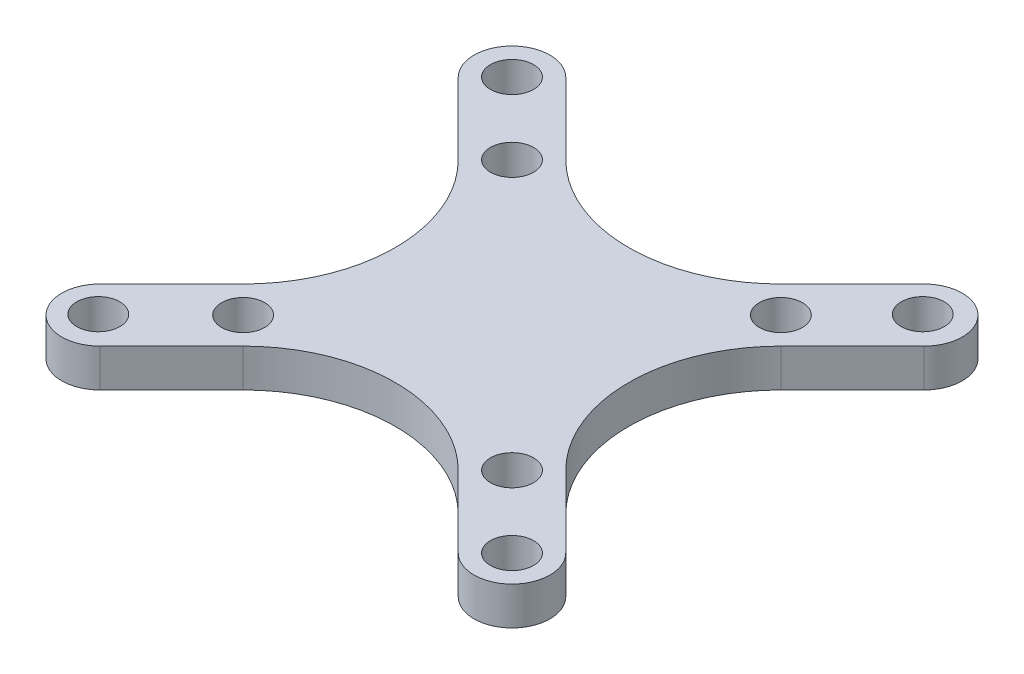
ISO-10303-21;
HEADER;
FILE_DESCRIPTION(('STEP AP214'),'2;1');
FILE_NAME('part.step','',(''),(''),'','','');
FILE_SCHEMA(('AUTOMOTIVE_DESIGN { 1 0 10303 214 1 1 1 1 }'));
ENDSEC;
DATA;
#1=APPLICATION_CONTEXT('core data for automotive mechanical design processes');
#2=APPLICATION_PROTOCOL_DEFINITION('international standard','automotive_design',2000,#1);
#3=PRODUCT_CONTEXT('',#1,'mechanical');
#4=PRODUCT('Part','Part','',(#3));
#5=PRODUCT_RELATED_PRODUCT_CATEGORY('part','',(#4));
#6=PRODUCT_DEFINITION_FORMATION('','',#4);
#7=PRODUCT_DEFINITION_CONTEXT('part definition',#1,'design');
#8=PRODUCT_DEFINITION('design','',#6,#7);
#9=PRODUCT_DEFINITION_SHAPE('','',#8);
#10=(LENGTH_UNIT() NAMED_UNIT(*) SI_UNIT(.MILLI.,.METRE.));
#11=(NAMED_UNIT(*) PLANE_ANGLE_UNIT() SI_UNIT($,.RADIAN.));
#12=(NAMED_UNIT(*) SI_UNIT($,.STERADIAN.) SOLID_ANGLE_UNIT());
#13=UNCERTAINTY_MEASURE_WITH_UNIT(LENGTH_MEASURE(1.E-05),#10,'distance_accuracy_value','');
#14=(GEOMETRIC_REPRESENTATION_CONTEXT(3) GLOBAL_UNCERTAINTY_ASSIGNED_CONTEXT((#13)) GLOBAL_UNIT_ASSIGNED_CONTEXT((#10,
#11,#12)) REPRESENTATION_CONTEXT('',''));
#15=CARTESIAN_POINT('',(0.,0.,0.));
#16=DIRECTION('',(0.,0.,1.));
#17=DIRECTION('',(1.,0.,0.));
#18=AXIS2_PLACEMENT_3D('',#15,#16,#17);
#19=CARTESIAN_POINT('',(-2.12132034355947,3.,2.12132034355949));
#20=DIRECTION('',(0.707106781186543,0.,-0.707106781186552));
#21=DIRECTION('',(-0.707106781186552,0.,-0.707106781186543));
#22=AXIS2_PLACEMENT_3D('',#19,#20,#21);
#23=PLANE('',#22);
#24=DIRECTION('',(0.707106781186552,0.,0.707106781186543));
#25=VECTOR('',#24,1.);
#26=CARTESIAN_POINT('',(-2.12132034355947,0.,2.12132034355949));
#27=LINE('',#26,#25);
#28=CARTESIAN_POINT('',(8.48528137423874,0.,12.7279220613576));
#29=VERTEX_POINT('',#28);
#30=CARTESIAN_POINT('',(14.1421356237312,0.,18.38477631085));
#31=VERTEX_POINT('',#30);
#32=EDGE_CURVE('E299',#29,#31,#27,.T.);
#33=ORIENTED_EDGE('',*,*,#32,.T.);
#34=DIRECTION('',(0.,-1.,0.));
#35=VECTOR('',#34,1.);
#36=CARTESIAN_POINT('',(14.1421356237312,3.,18.38477631085));
#37=LINE('',#36,#35);
#38=CARTESIAN_POINT('',(14.1421356237312,3.,18.38477631085));
#39=VERTEX_POINT('',#38);
#40=EDGE_CURVE('E159',#39,#31,#37,.T.);
#41=ORIENTED_EDGE('',*,*,#40,.F.);
#42=DIRECTION('',(0.707106781186552,0.,0.707106781186543));
#43=VECTOR('',#42,1.);
#44=CARTESIAN_POINT('',(-2.12132034355947,3.,2.12132034355949));
#45=LINE('',#44,#43);
#46=CARTESIAN_POINT('',(8.48528137423874,3.,12.7279220613576));
#47=VERTEX_POINT('',#46);
#48=EDGE_CURVE('E421',#47,#39,#45,.T.);
#49=ORIENTED_EDGE('',*,*,#48,.F.);
#50=DIRECTION('',(0.,-1.,0.));
#51=VECTOR('',#50,1.);
#52=CARTESIAN_POINT('',(8.48528137423874,3.,12.7279220613576));
#53=LINE('',#52,#51);
#54=EDGE_CURVE('E12',#47,#29,#53,.T.);
#55=ORIENTED_EDGE('',*,*,#54,.T.);
#56=EDGE_LOOP('',(#33,#41,#49,#55));
#57=FACE_BOUND('',#56,.T.);
#58=ADVANCED_FACE('F149',(#57),#23,.F.);
#59=CARTESIAN_POINT('',(16.2634559672908,3.,16.2634559672903));
#60=DIRECTION('',(0.,-1.,0.));
#61=DIRECTION('',(0.,0.,-1.));
#62=AXIS2_PLACEMENT_3D('',#59,#60,#61);
#63=CYLINDRICAL_SURFACE('',#62,2.99999999999976);
#64=CARTESIAN_POINT('',(16.2634559672908,0.,16.2634559672903));
#65=DIRECTION('',(0.,1.,0.));
#66=DIRECTION('',(0.,0.,1.));
#67=AXIS2_PLACEMENT_3D('',#64,#65,#66);
#68=CIRCLE('',#67,2.99999999999976);
#69=CARTESIAN_POINT('',(18.3847763108502,0.,14.142135623731));
#70=VERTEX_POINT('',#69);
#71=EDGE_CURVE('E303',#31,#70,#68,.T.);
#72=ORIENTED_EDGE('',*,*,#71,.T.);
#73=DIRECTION('',(0.,-1.,0.));
#74=VECTOR('',#73,1.);
#75=CARTESIAN_POINT('',(18.3847763108502,3.,14.142135623731));
#76=LINE('',#75,#74);
#77=CARTESIAN_POINT('',(18.3847763108502,3.,14.142135623731));
#78=VERTEX_POINT('',#77);
#79=EDGE_CURVE('E390',#78,#70,#76,.T.);
#80=ORIENTED_EDGE('',*,*,#79,.F.);
#81=CARTESIAN_POINT('',(16.2634559672908,3.,16.2634559672903));
#82=DIRECTION('',(0.,1.,0.));
#83=DIRECTION('',(0.,0.,1.));
#84=AXIS2_PLACEMENT_3D('',#81,#82,#83);
#85=CIRCLE('',#84,2.99999999999976);
#86=EDGE_CURVE('E400',#39,#78,#85,.T.);
#87=ORIENTED_EDGE('',*,*,#86,.F.);
#88=ORIENTED_EDGE('',*,*,#40,.T.);
#89=EDGE_LOOP('',(#72,#80,#87,#88));
#90=FACE_BOUND('',#89,.T.);
#91=ADVANCED_FACE('F398',(#90),#63,.T.);
#92=CARTESIAN_POINT('',(2.12132034355962,3.,-2.12132034355961));
#93=DIRECTION('',(0.70710678118655,0.,-0.707106781186545));
#94=DIRECTION('',(-0.707106781186545,0.,-0.70710678118655));
#95=AXIS2_PLACEMENT_3D('',#92,#93,#94);
#96=PLANE('',#95);
#97=DIRECTION('',(0.707106781186545,0.,0.70710678118655));
#98=VECTOR('',#97,1.);
#99=CARTESIAN_POINT('',(2.12132034355962,0.,-2.12132034355961));
#100=LINE('',#99,#98);
#101=CARTESIAN_POINT('',(12.7279220613577,0.,8.48528137423856));
#102=VERTEX_POINT('',#101);
#103=EDGE_CURVE('E307',#102,#70,#100,.T.);
#104=ORIENTED_EDGE('',*,*,#103,.F.);
#105=DIRECTION('',(0.,-1.,0.));
#106=VECTOR('',#105,1.);
#107=CARTESIAN_POINT('',(12.7279220613577,3.,8.48528137423856));
#108=LINE('',#107,#106);
#109=CARTESIAN_POINT('',(12.7279220613577,3.,8.48528137423856));
#110=VERTEX_POINT('',#109);
#111=EDGE_CURVE('E387',#110,#102,#108,.T.);
#112=ORIENTED_EDGE('',*,*,#111,.F.);
#113=DIRECTION('',(0.707106781186545,0.,0.70710678118655));
#114=VECTOR('',#113,1.);
#115=CARTESIAN_POINT('',(2.12132034355962,3.,-2.12132034355961));
#116=LINE('',#115,#114);
#117=EDGE_CURVE('E411',#110,#78,#116,.T.);
#118=ORIENTED_EDGE('',*,*,#117,.T.);
#119=ORIENTED_EDGE('',*,*,#79,.T.);
#120=EDGE_LOOP('',(#104,#112,#118,#119));
#121=FACE_BOUND('',#120,.T.);
#122=ADVANCED_FACE('F408',(#121),#96,.T.);
#123=CARTESIAN_POINT('',(21.2132034355962,3.,0.));
#124=DIRECTION('',(0.,-1.,0.));
#125=DIRECTION('',(0.,0.,-1.));
#126=AXIS2_PLACEMENT_3D('',#123,#124,#125);
#127=CYLINDRICAL_SURFACE('',#126,12.);
#128=CARTESIAN_POINT('',(21.2132034355962,0.,0.));
#129=DIRECTION('',(0.,1.,0.));
#130=DIRECTION('',(0.,0.,1.));
#131=AXIS2_PLACEMENT_3D('',#128,#129,#130);
#132=CIRCLE('',#131,12.);
#133=CARTESIAN_POINT('',(12.7279220613578,0.,-8.4852813742387));
#134=VERTEX_POINT('',#133);
#135=EDGE_CURVE('E311',#134,#102,#132,.T.);
#136=ORIENTED_EDGE('',*,*,#135,.F.);
#137=DIRECTION('',(0.,-1.,0.));
#138=VECTOR('',#137,1.);
#139=CARTESIAN_POINT('',(12.7279220613578,3.,-8.4852813742387));
#140=LINE('',#139,#138);
#141=CARTESIAN_POINT('',(12.7279220613578,3.,-8.4852813742387));
#142=VERTEX_POINT('',#141);
#143=EDGE_CURVE('E384',#142,#134,#140,.T.);
#144=ORIENTED_EDGE('',*,*,#143,.F.);
#145=CARTESIAN_POINT('',(21.2132034355962,3.,0.));
#146=DIRECTION('',(0.,1.,0.));
#147=DIRECTION('',(0.,0.,1.));
#148=AXIS2_PLACEMENT_3D('',#145,#146,#147);
#149=CIRCLE('',#148,12.);
#150=EDGE_CURVE('E415',#142,#110,#149,.T.);
#151=ORIENTED_EDGE('',*,*,#150,.T.);
#152=ORIENTED_EDGE('',*,*,#111,.T.);
#153=EDGE_LOOP('',(#136,#144,#151,#152));
#154=FACE_BOUND('',#153,.T.);
#155=ADVANCED_FACE('F471',(#154),#127,.F.);
#156=CARTESIAN_POINT('',(2.12132034355943,3.,2.12132034355947));
#157=DIRECTION('',(0.707106781186542,0.,0.707106781186553));
#158=DIRECTION('',(0.707106781186553,0.,-0.707106781186542));
#159=AXIS2_PLACEMENT_3D('',#156,#157,#158);
#160=PLANE('',#159);
#161=DIRECTION('',(-0.707106781186553,0.,0.707106781186542));
#162=VECTOR('',#161,1.);
#163=CARTESIAN_POINT('',(2.12132034355943,0.,2.12132034355947));
#164=LINE('',#163,#162);
#165=CARTESIAN_POINT('',(18.3847763108504,0.,-14.1421356237313));
#166=VERTEX_POINT('',#165);
#167=EDGE_CURVE('E315',#166,#134,#164,.T.);
#168=ORIENTED_EDGE('',*,*,#167,.F.);
#169=DIRECTION('',(0.,-1.,0.));
#170=VECTOR('',#169,1.);
#171=CARTESIAN_POINT('',(18.3847763108504,3.,-14.1421356237313));
#172=LINE('',#171,#170);
#173=CARTESIAN_POINT('',(18.3847763108504,3.,-14.1421356237313));
#174=VERTEX_POINT('',#173);
#175=EDGE_CURVE('E381',#174,#166,#172,.T.);
#176=ORIENTED_EDGE('',*,*,#175,.F.);
#177=DIRECTION('',(-0.707106781186553,0.,0.707106781186542));
#178=VECTOR('',#177,1.);
#179=CARTESIAN_POINT('',(2.12132034355943,3.,2.12132034355947));
#180=LINE('',#179,#178);
#181=EDGE_CURVE('E419',#174,#142,#180,.T.);
#182=ORIENTED_EDGE('',*,*,#181,.T.);
#183=ORIENTED_EDGE('',*,*,#143,.T.);
#184=EDGE_LOOP('',(#168,#176,#182,#183));
#185=FACE_BOUND('',#184,.T.);
#186=ADVANCED_FACE('F474',(#185),#160,.T.);
#187=CARTESIAN_POINT('',(16.2634559672906,3.,-16.2634559672907));
#188=DIRECTION('',(0.,-1.,0.));
#189=DIRECTION('',(0.,0.,-1.));
#190=AXIS2_PLACEMENT_3D('',#187,#188,#189);
#191=CYLINDRICAL_SURFACE('',#190,2.99999999999988);
#192=CARTESIAN_POINT('',(16.2634559672906,0.,-16.2634559672907));
#193=DIRECTION('',(0.,1.,0.));
#194=DIRECTION('',(0.,0.,1.));
#195=AXIS2_PLACEMENT_3D('',#192,#193,#194);
#196=CIRCLE('',#195,2.99999999999988);
#197=CARTESIAN_POINT('',(14.1421356237311,0.,-18.3847763108502));
#198=VERTEX_POINT('',#197);
#199=EDGE_CURVE('E319',#198,#166,#196,.F.);
#200=ORIENTED_EDGE('',*,*,#199,.F.);
#201=DIRECTION('',(0.,-1.,0.));
#202=VECTOR('',#201,1.);
#203=CARTESIAN_POINT('',(14.1421356237311,3.,-18.3847763108502));
#204=LINE('',#203,#202);
#205=CARTESIAN_POINT('',(14.1421356237311,3.,-18.3847763108502));
#206=VERTEX_POINT('',#205);
#207=EDGE_CURVE('E378',#206,#198,#204,.T.);
#208=ORIENTED_EDGE('',*,*,#207,.F.);
#209=CARTESIAN_POINT('',(16.2634559672906,3.,-16.2634559672907));
#210=DIRECTION('',(0.,1.,0.));
#211=DIRECTION('',(0.,0.,1.));
#212=AXIS2_PLACEMENT_3D('',#209,#210,#211);
#213=CIRCLE('',#212,2.99999999999988);
#214=EDGE_CURVE('E428',#206,#174,#213,.F.);
#215=ORIENTED_EDGE('',*,*,#214,.T.);
#216=ORIENTED_EDGE('',*,*,#175,.T.);
#217=EDGE_LOOP('',(#200,#208,#215,#216));
#218=FACE_BOUND('',#217,.T.);
#219=ADVANCED_FACE('F478',(#218),#191,.T.);
#220=CARTESIAN_POINT('',(-2.12132034355956,3.,-2.12132034355957));
#221=DIRECTION('',(0.707106781186546,0.,0.707106781186549));
#222=DIRECTION('',(0.707106781186549,0.,-0.707106781186546));
#223=AXIS2_PLACEMENT_3D('',#220,#221,#222);
#224=PLANE('',#223);
#225=DIRECTION('',(-0.707106781186549,0.,0.707106781186546));
#226=VECTOR('',#225,1.);
#227=CARTESIAN_POINT('',(-2.12132034355956,0.,-2.12132034355957));
#228=LINE('',#227,#226);
#229=CARTESIAN_POINT('',(8.48528137423882,0.,-12.7279220613579));
#230=VERTEX_POINT('',#229);
#231=EDGE_CURVE('E323',#198,#230,#228,.T.);
#232=ORIENTED_EDGE('',*,*,#231,.T.);
#233=DIRECTION('',(0.,-1.,0.));
#234=VECTOR('',#233,1.);
#235=CARTESIAN_POINT('',(8.48528137423882,3.,-12.7279220613579));
#236=LINE('',#235,#234);
#237=CARTESIAN_POINT('',(8.48528137423882,3.,-12.7279220613579));
#238=VERTEX_POINT('',#237);
#239=EDGE_CURVE('E374',#238,#230,#236,.T.);
#240=ORIENTED_EDGE('',*,*,#239,.F.);
#241=DIRECTION('',(-0.707106781186549,0.,0.707106781186546));
#242=VECTOR('',#241,1.);
#243=CARTESIAN_POINT('',(-2.12132034355956,3.,-2.12132034355957));
#244=LINE('',#243,#242);
#245=EDGE_CURVE('E432',#206,#238,#244,.T.);
#246=ORIENTED_EDGE('',*,*,#245,.F.);
#247=ORIENTED_EDGE('',*,*,#207,.T.);
#248=EDGE_LOOP('',(#232,#240,#246,#247));
#249=FACE_BOUND('',#248,.T.);
#250=ADVANCED_FACE('F482',(#249),#224,.F.);
#251=CARTESIAN_POINT('',(0.,3.,-21.2132034355965));
#252=DIRECTION('',(0.,-1.,0.));
#253=DIRECTION('',(0.,0.,-1.));
#254=AXIS2_PLACEMENT_3D('',#251,#252,#253);
#255=CYLINDRICAL_SURFACE('',#254,12.0000000000001);
#256=CARTESIAN_POINT('',(0.,0.,-21.2132034355965));
#257=DIRECTION('',(0.,1.,0.));
#258=DIRECTION('',(0.,0.,1.));
#259=AXIS2_PLACEMENT_3D('',#256,#257,#258);
#260=CIRCLE('',#259,12.0000000000001);
#261=CARTESIAN_POINT('',(-8.48528137423854,0.,-12.7279220613579));
#262=VERTEX_POINT('',#261);
#263=EDGE_CURVE('E326',#230,#262,#260,.F.);
#264=ORIENTED_EDGE('',*,*,#263,.T.);
#265=DIRECTION('',(0.,-1.,0.));
#266=VECTOR('',#265,1.);
#267=CARTESIAN_POINT('',(-8.48528137423854,3.,-12.7279220613579));
#268=LINE('',#267,#266);
#269=CARTESIAN_POINT('',(-8.48528137423854,3.,-12.7279220613579));
#270=VERTEX_POINT('',#269);
#271=EDGE_CURVE('E371',#270,#262,#268,.T.);
#272=ORIENTED_EDGE('',*,*,#271,.F.);
#273=CARTESIAN_POINT('',(0.,3.,-21.2132034355965));
#274=DIRECTION('',(0.,1.,0.));
#275=DIRECTION('',(0.,0.,1.));
#276=AXIS2_PLACEMENT_3D('',#273,#274,#275);
#277=CIRCLE('',#276,12.0000000000001);
#278=EDGE_CURVE('E435',#238,#270,#277,.F.);
#279=ORIENTED_EDGE('',*,*,#278,.F.);
#280=ORIENTED_EDGE('',*,*,#239,.T.);
#281=EDGE_LOOP('',(#264,#272,#279,#280));
#282=FACE_BOUND('',#281,.T.);
#283=ADVANCED_FACE('F486',(#282),#255,.F.);
#284=CARTESIAN_POINT('',(2.12132034355969,3.,-2.12132034355968));
#285=DIRECTION('',(0.707106781186549,0.,-0.707106781186546));
#286=DIRECTION('',(-0.707106781186546,0.,-0.707106781186549));
#287=AXIS2_PLACEMENT_3D('',#284,#285,#286);
#288=PLANE('',#287);
#289=DIRECTION('',(0.707106781186546,0.,0.707106781186549));
#290=VECTOR('',#289,1.);
#291=CARTESIAN_POINT('',(2.12132034355969,0.,-2.12132034355968));
#292=LINE('',#291,#290);
#293=CARTESIAN_POINT('',(-14.1421356237309,0.,-18.3847763108503));
#294=VERTEX_POINT('',#293);
#295=EDGE_CURVE('E330',#294,#262,#292,.T.);
#296=ORIENTED_EDGE('',*,*,#295,.F.);
#297=DIRECTION('',(0.,-1.,0.));
#298=VECTOR('',#297,1.);
#299=CARTESIAN_POINT('',(-14.1421356237309,3.,-18.3847763108503));
#300=LINE('',#299,#298);
#301=CARTESIAN_POINT('',(-14.1421356237309,3.,-18.3847763108503));
#302=VERTEX_POINT('',#301);
#303=EDGE_CURVE('E368',#302,#294,#300,.T.);
#304=ORIENTED_EDGE('',*,*,#303,.F.);
#305=DIRECTION('',(0.707106781186546,0.,0.707106781186549));
#306=VECTOR('',#305,1.);
#307=CARTESIAN_POINT('',(2.12132034355969,3.,-2.12132034355968));
#308=LINE('',#307,#306);
#309=EDGE_CURVE('E438',#302,#270,#308,.T.);
#310=ORIENTED_EDGE('',*,*,#309,.T.);
#311=ORIENTED_EDGE('',*,*,#271,.T.);
#312=EDGE_LOOP('',(#296,#304,#310,#311));
#313=FACE_BOUND('',#312,.T.);
#314=ADVANCED_FACE('F490',(#313),#288,.T.);
#315=CARTESIAN_POINT('',(-16.2634559672905,3.,-16.2634559672907));
#316=DIRECTION('',(0.,-1.,0.));
#317=DIRECTION('',(0.,0.,-1.));
#318=AXIS2_PLACEMENT_3D('',#315,#316,#317);
#319=CYLINDRICAL_SURFACE('',#318,3.);
#320=CARTESIAN_POINT('',(-16.2634559672905,0.,-16.2634559672907));
#321=DIRECTION('',(0.,1.,0.));
#322=DIRECTION('',(0.,0.,1.));
#323=AXIS2_PLACEMENT_3D('',#320,#321,#322);
#324=CIRCLE('',#323,3.);
#325=CARTESIAN_POINT('',(-18.3847763108501,0.,-14.142135623731));
#326=VERTEX_POINT('',#325);
#327=EDGE_CURVE('E334',#326,#294,#324,.F.);
#328=ORIENTED_EDGE('',*,*,#327,.F.);
#329=DIRECTION('',(0.,-1.,0.));
#330=VECTOR('',#329,1.);
#331=CARTESIAN_POINT('',(-18.3847763108501,3.,-14.142135623731));
#332=LINE('',#331,#330);
#333=CARTESIAN_POINT('',(-18.3847763108501,3.,-14.142135623731));
#334=VERTEX_POINT('',#333);
#335=EDGE_CURVE('E365',#334,#326,#332,.T.);
#336=ORIENTED_EDGE('',*,*,#335,.F.);
#337=CARTESIAN_POINT('',(-16.2634559672905,3.,-16.2634559672907));
#338=DIRECTION('',(0.,1.,0.));
#339=DIRECTION('',(0.,0.,1.));
#340=AXIS2_PLACEMENT_3D('',#337,#338,#339);
#341=CIRCLE('',#340,3.);
#342=EDGE_CURVE('E442',#334,#302,#341,.F.);
#343=ORIENTED_EDGE('',*,*,#342,.T.);
#344=ORIENTED_EDGE('',*,*,#303,.T.);
#345=EDGE_LOOP('',(#328,#336,#343,#344));
#346=FACE_BOUND('',#345,.T.);
#347=ADVANCED_FACE('F494',(#346),#319,.T.);
#348=CARTESIAN_POINT('',(-2.12132034355947,3.,2.12132034355949));
#349=DIRECTION('',(0.707106781186544,0.,-0.707106781186551));
#350=DIRECTION('',(-0.707106781186551,0.,-0.707106781186544));
#351=AXIS2_PLACEMENT_3D('',#348,#349,#350);
#352=PLANE('',#351);
#353=DIRECTION('',(0.707106781186551,0.,0.707106781186544));
#354=VECTOR('',#353,1.);
#355=CARTESIAN_POINT('',(-2.12132034355947,0.,2.12132034355949));
#356=LINE('',#355,#354);
#357=CARTESIAN_POINT('',(-12.7279220613578,0.,-8.48528137423871));
#358=VERTEX_POINT('',#357);
#359=EDGE_CURVE('E338',#326,#358,#356,.T.);
#360=ORIENTED_EDGE('',*,*,#359,.T.);
#361=DIRECTION('',(0.,-1.,0.));
#362=VECTOR('',#361,1.);
#363=CARTESIAN_POINT('',(-12.7279220613578,3.,-8.48528137423871));
#364=LINE('',#363,#362);
#365=CARTESIAN_POINT('',(-12.7279220613578,3.,-8.48528137423871));
#366=VERTEX_POINT('',#365);
#367=EDGE_CURVE('E362',#366,#358,#364,.T.);
#368=ORIENTED_EDGE('',*,*,#367,.F.);
#369=DIRECTION('',(0.707106781186551,0.,0.707106781186544));
#370=VECTOR('',#369,1.);
#371=CARTESIAN_POINT('',(-2.12132034355947,3.,2.12132034355949));
#372=LINE('',#371,#370);
#373=EDGE_CURVE('E446',#334,#366,#372,.T.);
#374=ORIENTED_EDGE('',*,*,#373,.F.);
#375=ORIENTED_EDGE('',*,*,#335,.T.);
#376=EDGE_LOOP('',(#360,#368,#374,#375));
#377=FACE_BOUND('',#376,.T.);
#378=ADVANCED_FACE('F498',(#377),#352,.F.);
#379=CARTESIAN_POINT('',(-21.2132034355964,3.,0.));
#380=DIRECTION('',(0.,-1.,0.));
#381=DIRECTION('',(0.,0.,-1.));
#382=AXIS2_PLACEMENT_3D('',#379,#380,#381);
#383=CYLINDRICAL_SURFACE('',#382,12.0000000000001);
#384=CARTESIAN_POINT('',(-21.2132034355964,0.,0.));
#385=DIRECTION('',(0.,1.,0.));
#386=DIRECTION('',(0.,0.,1.));
#387=AXIS2_PLACEMENT_3D('',#384,#385,#386);
#388=CIRCLE('',#387,12.0000000000001);
#389=CARTESIAN_POINT('',(-12.7279220613577,0.,8.48528137423865));
#390=VERTEX_POINT('',#389);
#391=EDGE_CURVE('E342',#390,#358,#388,.T.);
#392=ORIENTED_EDGE('',*,*,#391,.F.);
#393=DIRECTION('',(0.,-1.,0.));
#394=VECTOR('',#393,1.);
#395=CARTESIAN_POINT('',(-12.7279220613577,3.,8.48528137423865));
#396=LINE('',#395,#394);
#397=CARTESIAN_POINT('',(-12.7279220613577,3.,8.48528137423865));
#398=VERTEX_POINT('',#397);
#399=EDGE_CURVE('E286',#398,#390,#396,.T.);
#400=ORIENTED_EDGE('',*,*,#399,.F.);
#401=CARTESIAN_POINT('',(-21.2132034355964,3.,0.));
#402=DIRECTION('',(0.,1.,0.));
#403=DIRECTION('',(0.,0.,1.));
#404=AXIS2_PLACEMENT_3D('',#401,#402,#403);
#405=CIRCLE('',#404,12.0000000000001);
#406=EDGE_CURVE('E274',#398,#366,#405,.T.);
#407=ORIENTED_EDGE('',*,*,#406,.T.);
#408=ORIENTED_EDGE('',*,*,#367,.T.);
#409=EDGE_LOOP('',(#392,#400,#407,#408));
#410=FACE_BOUND('',#409,.T.);
#411=ADVANCED_FACE('F451',(#410),#383,.F.);
#412=CARTESIAN_POINT('',(-2.12132034355979,3.,-2.12132034355971));
#413=DIRECTION('',(0.707106781186562,0.,0.707106781186533));
#414=DIRECTION('',(0.707106781186533,0.,-0.707106781186562));
#415=AXIS2_PLACEMENT_3D('',#412,#413,#414);
#416=PLANE('',#415);
#417=DIRECTION('',(-0.707106781186533,0.,0.707106781186562));
#418=VECTOR('',#417,1.);
#419=CARTESIAN_POINT('',(-2.12132034355979,0.,-2.12132034355971));
#420=LINE('',#419,#418);
#421=CARTESIAN_POINT('',(-18.38477631085,0.,14.1421356237311));
#422=VERTEX_POINT('',#421);
#423=EDGE_CURVE('E282',#390,#422,#420,.T.);
#424=ORIENTED_EDGE('',*,*,#423,.T.);
#425=DIRECTION('',(0.,-1.,0.));
#426=VECTOR('',#425,1.);
#427=CARTESIAN_POINT('',(-18.38477631085,3.,14.1421356237311));
#428=LINE('',#427,#426);
#429=CARTESIAN_POINT('',(-18.38477631085,3.,14.1421356237311));
#430=VERTEX_POINT('',#429);
#431=EDGE_CURVE('E279',#430,#422,#428,.T.);
#432=ORIENTED_EDGE('',*,*,#431,.F.);
#433=DIRECTION('',(-0.707106781186533,0.,0.707106781186562));
#434=VECTOR('',#433,1.);
#435=CARTESIAN_POINT('',(-2.12132034355979,3.,-2.12132034355971));
#436=LINE('',#435,#434);
#437=EDGE_CURVE('E266',#398,#430,#436,.T.);
#438=ORIENTED_EDGE('',*,*,#437,.F.);
#439=ORIENTED_EDGE('',*,*,#399,.T.);
#440=EDGE_LOOP('',(#424,#432,#438,#439));
#441=FACE_BOUND('',#440,.T.);
#442=ADVANCED_FACE('F280',(#441),#416,.F.);
#443=CARTESIAN_POINT('',(-16.2634559672906,3.,16.2634559672905));
#444=DIRECTION('',(0.,-1.,0.));
#445=DIRECTION('',(0.,0.,-1.));
#446=AXIS2_PLACEMENT_3D('',#443,#444,#445);
#447=CYLINDRICAL_SURFACE('',#446,2.99999999999992);
#448=CARTESIAN_POINT('',(-16.2634559672906,0.,16.2634559672905));
#449=DIRECTION('',(0.,1.,0.));
#450=DIRECTION('',(0.,0.,1.));
#451=AXIS2_PLACEMENT_3D('',#448,#449,#450);
#452=CIRCLE('',#451,2.99999999999992);
#453=CARTESIAN_POINT('',(-14.1421356237306,0.,18.3847763108501));
#454=VERTEX_POINT('',#453);
#455=EDGE_CURVE('E348',#454,#422,#452,.F.);
#456=ORIENTED_EDGE('',*,*,#455,.F.);
#457=DIRECTION('',(0.,-1.,0.));
#458=VECTOR('',#457,1.);
#459=CARTESIAN_POINT('',(-14.1421356237306,3.,18.3847763108501));
#460=LINE('',#459,#458);
#461=CARTESIAN_POINT('',(-14.1421356237306,3.,18.3847763108501));
#462=VERTEX_POINT('',#461);
#463=EDGE_CURVE('E216',#462,#454,#460,.T.);
#464=ORIENTED_EDGE('',*,*,#463,.F.);
#465=CARTESIAN_POINT('',(-16.2634559672906,3.,16.2634559672905));
#466=DIRECTION('',(0.,1.,0.));
#467=DIRECTION('',(0.,0.,1.));
#468=AXIS2_PLACEMENT_3D('',#465,#466,#467);
#469=CIRCLE('',#468,2.99999999999992);
#470=EDGE_CURVE('E272',#462,#430,#469,.F.);
#471=ORIENTED_EDGE('',*,*,#470,.T.);
#472=ORIENTED_EDGE('',*,*,#431,.T.);
#473=EDGE_LOOP('',(#456,#464,#471,#472));
#474=FACE_BOUND('',#473,.T.);
#475=ADVANCED_FACE('F288',(#474),#447,.T.);
#476=CARTESIAN_POINT('',(2.12132034355924,3.,2.12132034355909));
#477=DIRECTION('',(0.707106781186573,0.,0.707106781186522));
#478=DIRECTION('',(0.707106781186522,0.,-0.707106781186573));
#479=AXIS2_PLACEMENT_3D('',#476,#477,#478);
#480=PLANE('',#479);
#481=DIRECTION('',(-0.707106781186522,0.,0.707106781186573));
#482=VECTOR('',#481,1.);
#483=CARTESIAN_POINT('',(2.12132034355924,0.,2.12132034355909));
#484=LINE('',#483,#482);
#485=CARTESIAN_POINT('',(-8.48528137423854,0.,12.7279220613576));
#486=VERTEX_POINT('',#485);
#487=EDGE_CURVE('E351',#486,#454,#484,.T.);
#488=ORIENTED_EDGE('',*,*,#487,.F.);
#489=DIRECTION('',(0.,-1.,0.));
#490=VECTOR('',#489,1.);
#491=CARTESIAN_POINT('',(-8.48528137423854,3.,12.7279220613576));
#492=LINE('',#491,#490);
#493=CARTESIAN_POINT('',(-8.48528137423854,3.,12.7279220613576));
#494=VERTEX_POINT('',#493);
#495=EDGE_CURVE('E167',#494,#486,#492,.T.);
#496=ORIENTED_EDGE('',*,*,#495,.F.);
#497=DIRECTION('',(-0.707106781186522,0.,0.707106781186573));
#498=VECTOR('',#497,1.);
#499=CARTESIAN_POINT('',(2.12132034355924,3.,2.12132034355909));
#500=LINE('',#499,#498);
#501=EDGE_CURVE('E290',#494,#462,#500,.T.);
#502=ORIENTED_EDGE('',*,*,#501,.T.);
#503=ORIENTED_EDGE('',*,*,#463,.T.);
#504=EDGE_LOOP('',(#488,#496,#502,#503));
#505=FACE_BOUND('',#504,.T.);
#506=ADVANCED_FACE('F454',(#505),#480,.T.);
#507=CARTESIAN_POINT('',(1.23165366794339E-13,3.,21.2132034355961));
#508=DIRECTION('',(0.,-1.,0.));
#509=DIRECTION('',(0.,0.,-1.));
#510=AXIS2_PLACEMENT_3D('',#507,#508,#509);
#511=CYLINDRICAL_SURFACE('',#510,12.);
#512=CARTESIAN_POINT('',(1.23165366794339E-13,0.,21.2132034355961));
#513=DIRECTION('',(0.,1.,0.));
#514=DIRECTION('',(0.,0.,1.));
#515=AXIS2_PLACEMENT_3D('',#512,#513,#514);
#516=CIRCLE('',#515,12.);
#517=EDGE_CURVE('E296',#29,#486,#516,.T.);
#518=ORIENTED_EDGE('',*,*,#517,.F.);
#519=ORIENTED_EDGE('',*,*,#54,.F.);
#520=CARTESIAN_POINT('',(1.23165366794339E-13,3.,21.2132034355961));
#521=DIRECTION('',(0.,1.,0.));
#522=DIRECTION('',(0.,0.,1.));
#523=AXIS2_PLACEMENT_3D('',#520,#521,#522);
#524=CIRCLE('',#523,12.);
#525=EDGE_CURVE('E355',#47,#494,#524,.T.);
#526=ORIENTED_EDGE('',*,*,#525,.T.);
#527=ORIENTED_EDGE('',*,*,#495,.T.);
#528=EDGE_LOOP('',(#518,#519,#526,#527));
#529=FACE_BOUND('',#528,.T.);
#530=ADVANCED_FACE('F151',(#529),#511,.F.);
#531=CARTESIAN_POINT('',(0.,0.,0.));
#532=DIRECTION('',(0.,1.,0.));
#533=DIRECTION('',(0.,0.,1.));
#534=AXIS2_PLACEMENT_3D('',#531,#532,#533);
#535=PLANE('',#534);
#536=CARTESIAN_POINT('',(-16.3795129611335,0.,16.2634559672905));
#537=DIRECTION('',(0.,1.,0.));
#538=DIRECTION('',(0.,0.,1.));
#539=AXIS2_PLACEMENT_3D('',#536,#537,#538);
#540=CIRCLE('',#539,1.7);
#541=CARTESIAN_POINT('',(-16.3795129611335,0.,17.9634559672905));
#542=VERTEX_POINT('',#541);
#543=EDGE_CURVE('E814',#542,#542,#540,.T.);
#544=ORIENTED_EDGE('',*,*,#543,.T.);
#545=EDGE_LOOP('',(#544));
#546=FACE_BOUND('',#545,.T.);
#547=CARTESIAN_POINT('',(-10.6066017177982,0.,10.6066017177981));
#548=DIRECTION('',(0.,1.,0.));
#549=DIRECTION('',(0.,0.,1.));
#550=AXIS2_PLACEMENT_3D('',#547,#548,#549);
#551=CIRCLE('',#550,1.7);
#552=CARTESIAN_POINT('',(-10.6066017177982,0.,12.3066017177981));
#553=VERTEX_POINT('',#552);
#554=EDGE_CURVE('E827',#553,#553,#551,.T.);
#555=ORIENTED_EDGE('',*,*,#554,.T.);
#556=EDGE_LOOP('',(#555));
#557=FACE_BOUND('',#556,.T.);
#558=CARTESIAN_POINT('',(16.2634559672905,0.,16.2634559672907));
#559=DIRECTION('',(0.,1.,0.));
#560=DIRECTION('',(0.,0.,1.));
#561=AXIS2_PLACEMENT_3D('',#558,#559,#560);
#562=CIRCLE('',#561,1.7);
#563=CARTESIAN_POINT('',(16.2634559672905,0.,17.9634559672907));
#564=VERTEX_POINT('',#563);
#565=EDGE_CURVE('E835',#564,#564,#562,.T.);
#566=ORIENTED_EDGE('',*,*,#565,.T.);
#567=EDGE_LOOP('',(#566));
#568=FACE_BOUND('',#567,.T.);
#569=CARTESIAN_POINT('',(10.6066017177982,0.,10.6066017177982));
#570=DIRECTION('',(0.,1.,0.));
#571=DIRECTION('',(0.,0.,1.));
#572=AXIS2_PLACEMENT_3D('',#569,#570,#571);
#573=CIRCLE('',#572,1.7);
#574=CARTESIAN_POINT('',(10.6066017177982,0.,12.3066017177982));
#575=VERTEX_POINT('',#574);
#576=EDGE_CURVE('E843',#575,#575,#573,.T.);
#577=ORIENTED_EDGE('',*,*,#576,.T.);
#578=EDGE_LOOP('',(#577));
#579=FACE_BOUND('',#578,.T.);
#580=CARTESIAN_POINT('',(16.1473989734477,0.,-16.2634559672907));
#581=DIRECTION('',(0.,1.,0.));
#582=DIRECTION('',(0.,0.,1.));
#583=AXIS2_PLACEMENT_3D('',#580,#581,#582);
#584=CIRCLE('',#583,1.7);
#585=CARTESIAN_POINT('',(16.1473989734477,0.,-14.5634559672907));
#586=VERTEX_POINT('',#585);
#587=EDGE_CURVE('E851',#586,#586,#584,.T.);
#588=ORIENTED_EDGE('',*,*,#587,.T.);
#589=EDGE_LOOP('',(#588));
#590=FACE_BOUND('',#589,.T.);
#591=CARTESIAN_POINT('',(10.6066017177983,0.,-10.6066017177983));
#592=DIRECTION('',(0.,1.,0.));
#593=DIRECTION('',(0.,0.,1.));
#594=AXIS2_PLACEMENT_3D('',#591,#592,#593);
#595=CIRCLE('',#594,1.7);
#596=CARTESIAN_POINT('',(10.6066017177983,0.,-8.9066017177983));
#597=VERTEX_POINT('',#596);
#598=EDGE_CURVE('E859',#597,#597,#595,.T.);
#599=ORIENTED_EDGE('',*,*,#598,.T.);
#600=EDGE_LOOP('',(#599));
#601=FACE_BOUND('',#600,.T.);
#602=CARTESIAN_POINT('',(-10.6066017177981,0.,-10.6066017177983));
#603=DIRECTION('',(0.,1.,0.));
#604=DIRECTION('',(0.,0.,1.));
#605=AXIS2_PLACEMENT_3D('',#602,#603,#604);
#606=CIRCLE('',#605,1.7);
#607=CARTESIAN_POINT('',(-10.6066017177981,0.,-8.90660171779829));
#608=VERTEX_POINT('',#607);
#609=EDGE_CURVE('E867',#608,#608,#606,.T.);
#610=ORIENTED_EDGE('',*,*,#609,.T.);
#611=EDGE_LOOP('',(#610));
#612=FACE_BOUND('',#611,.T.);
#613=CARTESIAN_POINT('',(-16.2634559672906,0.,-16.2634559672906));
#614=DIRECTION('',(0.,1.,0.));
#615=DIRECTION('',(0.,0.,1.));
#616=AXIS2_PLACEMENT_3D('',#613,#614,#615);
#617=CIRCLE('',#616,1.7);
#618=CARTESIAN_POINT('',(-16.2634559672906,0.,-14.5634559672906));
#619=VERTEX_POINT('',#618);
#620=EDGE_CURVE('E300',#619,#619,#617,.T.);
#621=ORIENTED_EDGE('',*,*,#620,.T.);
#622=EDGE_LOOP('',(#621));
#623=FACE_BOUND('',#622,.T.);
#624=ORIENTED_EDGE('',*,*,#517,.T.);
#625=ORIENTED_EDGE('',*,*,#487,.T.);
#626=ORIENTED_EDGE('',*,*,#455,.T.);
#627=ORIENTED_EDGE('',*,*,#423,.F.);
#628=ORIENTED_EDGE('',*,*,#391,.T.);
#629=ORIENTED_EDGE('',*,*,#359,.F.);
#630=ORIENTED_EDGE('',*,*,#327,.T.);
#631=ORIENTED_EDGE('',*,*,#295,.T.);
#632=ORIENTED_EDGE('',*,*,#263,.F.);
#633=ORIENTED_EDGE('',*,*,#231,.F.);
#634=ORIENTED_EDGE('',*,*,#199,.T.);
#635=ORIENTED_EDGE('',*,*,#167,.T.);
#636=ORIENTED_EDGE('',*,*,#135,.T.);
#637=ORIENTED_EDGE('',*,*,#103,.T.);
#638=ORIENTED_EDGE('',*,*,#71,.F.);
#639=ORIENTED_EDGE('',*,*,#32,.F.);
#640=EDGE_LOOP('',(#624,#625,#626,#627,#628,#629,#630,#631,#632,#633,#634,#635,#636,#637,#638,#639));
#641=FACE_BOUND('',#640,.T.);
#642=ADVANCED_FACE('F404',(#546,#557,#568,#579,#590,#601,#612,#623,#641),#535,.F.);
#643=CARTESIAN_POINT('',(0.,3.,0.));
#644=DIRECTION('',(0.,1.,0.));
#645=DIRECTION('',(0.,0.,1.));
#646=AXIS2_PLACEMENT_3D('',#643,#644,#645);
#647=PLANE('',#646);
#648=CARTESIAN_POINT('',(-16.3795129611335,3.,16.2634559672905));
#649=DIRECTION('',(0.,1.,0.));
#650=DIRECTION('',(0.,0.,1.));
#651=AXIS2_PLACEMENT_3D('',#648,#649,#650);
#652=CIRCLE('',#651,1.69999999999999);
#653=CARTESIAN_POINT('',(-16.3795129611335,3.,17.9634559672905));
#654=VERTEX_POINT('',#653);
#655=EDGE_CURVE('E817',#654,#654,#652,.T.);
#656=ORIENTED_EDGE('',*,*,#655,.F.);
#657=EDGE_LOOP('',(#656));
#658=FACE_BOUND('',#657,.T.);
#659=CARTESIAN_POINT('',(-10.6066017177982,3.,10.6066017177981));
#660=DIRECTION('',(0.,1.,0.));
#661=DIRECTION('',(0.,0.,1.));
#662=AXIS2_PLACEMENT_3D('',#659,#660,#661);
#663=CIRCLE('',#662,1.69999999999999);
#664=CARTESIAN_POINT('',(-10.6066017177982,3.,12.3066017177981));
#665=VERTEX_POINT('',#664);
#666=EDGE_CURVE('E821',#665,#665,#663,.T.);
#667=ORIENTED_EDGE('',*,*,#666,.F.);
#668=EDGE_LOOP('',(#667));
#669=FACE_BOUND('',#668,.T.);
#670=CARTESIAN_POINT('',(16.2634559672905,3.,16.2634559672907));
#671=DIRECTION('',(0.,1.,0.));
#672=DIRECTION('',(0.,0.,1.));
#673=AXIS2_PLACEMENT_3D('',#670,#671,#672);
#674=CIRCLE('',#673,1.69999999999999);
#675=CARTESIAN_POINT('',(16.2634559672905,3.,17.9634559672906));
#676=VERTEX_POINT('',#675);
#677=EDGE_CURVE('E831',#676,#676,#674,.T.);
#678=ORIENTED_EDGE('',*,*,#677,.F.);
#679=EDGE_LOOP('',(#678));
#680=FACE_BOUND('',#679,.T.);
#681=CARTESIAN_POINT('',(10.6066017177982,3.,10.6066017177982));
#682=DIRECTION('',(0.,1.,0.));
#683=DIRECTION('',(0.,0.,1.));
#684=AXIS2_PLACEMENT_3D('',#681,#682,#683);
#685=CIRCLE('',#684,1.69999999999999);
#686=CARTESIAN_POINT('',(10.6066017177982,3.,12.3066017177982));
#687=VERTEX_POINT('',#686);
#688=EDGE_CURVE('E839',#687,#687,#685,.T.);
#689=ORIENTED_EDGE('',*,*,#688,.F.);
#690=EDGE_LOOP('',(#689));
#691=FACE_BOUND('',#690,.T.);
#692=CARTESIAN_POINT('',(16.1473989734477,3.,-16.2634559672907));
#693=DIRECTION('',(0.,1.,0.));
#694=DIRECTION('',(0.,0.,1.));
#695=AXIS2_PLACEMENT_3D('',#692,#693,#694);
#696=CIRCLE('',#695,1.69999999999999);
#697=CARTESIAN_POINT('',(16.1473989734477,3.,-14.5634559672907));
#698=VERTEX_POINT('',#697);
#699=EDGE_CURVE('E847',#698,#698,#696,.T.);
#700=ORIENTED_EDGE('',*,*,#699,.F.);
#701=EDGE_LOOP('',(#700));
#702=FACE_BOUND('',#701,.T.);
#703=CARTESIAN_POINT('',(10.6066017177983,3.,-10.6066017177983));
#704=DIRECTION('',(0.,1.,0.));
#705=DIRECTION('',(0.,0.,1.));
#706=AXIS2_PLACEMENT_3D('',#703,#704,#705);
#707=CIRCLE('',#706,1.69999999999999);
#708=CARTESIAN_POINT('',(10.6066017177983,3.,-8.90660171779831));
#709=VERTEX_POINT('',#708);
#710=EDGE_CURVE('E855',#709,#709,#707,.T.);
#711=ORIENTED_EDGE('',*,*,#710,.F.);
#712=EDGE_LOOP('',(#711));
#713=FACE_BOUND('',#712,.T.);
#714=CARTESIAN_POINT('',(-10.6066017177981,3.,-10.6066017177983));
#715=DIRECTION('',(0.,1.,0.));
#716=DIRECTION('',(0.,0.,1.));
#717=AXIS2_PLACEMENT_3D('',#714,#715,#716);
#718=CIRCLE('',#717,1.69999999999999);
#719=CARTESIAN_POINT('',(-10.6066017177981,3.,-8.9066017177983));
#720=VERTEX_POINT('',#719);
#721=EDGE_CURVE('E863',#720,#720,#718,.T.);
#722=ORIENTED_EDGE('',*,*,#721,.F.);
#723=EDGE_LOOP('',(#722));
#724=FACE_BOUND('',#723,.T.);
#725=CARTESIAN_POINT('',(-16.2634559672906,3.,-16.2634559672906));
#726=DIRECTION('',(0.,1.,0.));
#727=DIRECTION('',(0.,0.,1.));
#728=AXIS2_PLACEMENT_3D('',#725,#726,#727);
#729=CIRCLE('',#728,1.69999999999999);
#730=CARTESIAN_POINT('',(-16.2634559672906,3.,-14.5634559672907));
#731=VERTEX_POINT('',#730);
#732=EDGE_CURVE('E871',#731,#731,#729,.T.);
#733=ORIENTED_EDGE('',*,*,#732,.F.);
#734=EDGE_LOOP('',(#733));
#735=FACE_BOUND('',#734,.T.);
#736=ORIENTED_EDGE('',*,*,#525,.F.);
#737=ORIENTED_EDGE('',*,*,#48,.T.);
#738=ORIENTED_EDGE('',*,*,#86,.T.);
#739=ORIENTED_EDGE('',*,*,#117,.F.);
#740=ORIENTED_EDGE('',*,*,#150,.F.);
#741=ORIENTED_EDGE('',*,*,#181,.F.);
#742=ORIENTED_EDGE('',*,*,#214,.F.);
#743=ORIENTED_EDGE('',*,*,#245,.T.);
#744=ORIENTED_EDGE('',*,*,#278,.T.);
#745=ORIENTED_EDGE('',*,*,#309,.F.);
#746=ORIENTED_EDGE('',*,*,#342,.F.);
#747=ORIENTED_EDGE('',*,*,#373,.T.);
#748=ORIENTED_EDGE('',*,*,#406,.F.);
#749=ORIENTED_EDGE('',*,*,#437,.T.);
#750=ORIENTED_EDGE('',*,*,#470,.F.);
#751=ORIENTED_EDGE('',*,*,#501,.F.);
#752=EDGE_LOOP('',(#736,#737,#738,#739,#740,#741,#742,#743,#744,#745,#746,#747,#748,#749,#750,#751));
#753=FACE_BOUND('',#752,.T.);
#754=ADVANCED_FACE('F269',(#658,#669,#680,#691,#702,#713,#724,#735,#753),#647,.T.);
#755=CARTESIAN_POINT('',(-16.2634559672906,3.,-16.2634559672906));
#756=DIRECTION('',(0.,1.,0.));
#757=DIRECTION('',(0.,0.,1.));
#758=AXIS2_PLACEMENT_3D('',#755,#756,#757);
#759=CYLINDRICAL_SURFACE('',#758,1.69999999999999);
#760=ORIENTED_EDGE('',*,*,#620,.F.);
#761=EDGE_LOOP('',(#760));
#762=FACE_BOUND('',#761,.T.);
#763=ORIENTED_EDGE('',*,*,#732,.T.);
#764=EDGE_LOOP('',(#763));
#765=FACE_BOUND('',#764,.T.);
#766=ADVANCED_FACE('F541',(#762,#765),#759,.F.);
#767=CARTESIAN_POINT('',(-10.6066017177981,3.,-10.6066017177983));
#768=DIRECTION('',(0.,1.,0.));
#769=DIRECTION('',(0.,0.,1.));
#770=AXIS2_PLACEMENT_3D('',#767,#768,#769);
#771=CYLINDRICAL_SURFACE('',#770,1.69999999999999);
#772=ORIENTED_EDGE('',*,*,#609,.F.);
#773=EDGE_LOOP('',(#772));
#774=FACE_BOUND('',#773,.T.);
#775=ORIENTED_EDGE('',*,*,#721,.T.);
#776=EDGE_LOOP('',(#775));
#777=FACE_BOUND('',#776,.T.);
#778=ADVANCED_FACE('F551',(#774,#777),#771,.F.);
#779=CARTESIAN_POINT('',(10.6066017177983,3.,-10.6066017177983));
#780=DIRECTION('',(0.,1.,0.));
#781=DIRECTION('',(0.,0.,1.));
#782=AXIS2_PLACEMENT_3D('',#779,#780,#781);
#783=CYLINDRICAL_SURFACE('',#782,1.69999999999999);
#784=ORIENTED_EDGE('',*,*,#598,.F.);
#785=EDGE_LOOP('',(#784));
#786=FACE_BOUND('',#785,.T.);
#787=ORIENTED_EDGE('',*,*,#710,.T.);
#788=EDGE_LOOP('',(#787));
#789=FACE_BOUND('',#788,.T.);
#790=ADVANCED_FACE('F561',(#786,#789),#783,.F.);
#791=CARTESIAN_POINT('',(16.1473989734477,3.,-16.2634559672907));
#792=DIRECTION('',(0.,1.,0.));
#793=DIRECTION('',(0.,0.,1.));
#794=AXIS2_PLACEMENT_3D('',#791,#792,#793);
#795=CYLINDRICAL_SURFACE('',#794,1.69999999999999);
#796=ORIENTED_EDGE('',*,*,#587,.F.);
#797=EDGE_LOOP('',(#796));
#798=FACE_BOUND('',#797,.T.);
#799=ORIENTED_EDGE('',*,*,#699,.T.);
#800=EDGE_LOOP('',(#799));
#801=FACE_BOUND('',#800,.T.);
#802=ADVANCED_FACE('F571',(#798,#801),#795,.F.);
#803=CARTESIAN_POINT('',(10.6066017177982,3.,10.6066017177982));
#804=DIRECTION('',(0.,1.,0.));
#805=DIRECTION('',(0.,0.,1.));
#806=AXIS2_PLACEMENT_3D('',#803,#804,#805);
#807=CYLINDRICAL_SURFACE('',#806,1.69999999999999);
#808=ORIENTED_EDGE('',*,*,#576,.F.);
#809=EDGE_LOOP('',(#808));
#810=FACE_BOUND('',#809,.T.);
#811=ORIENTED_EDGE('',*,*,#688,.T.);
#812=EDGE_LOOP('',(#811));
#813=FACE_BOUND('',#812,.T.);
#814=ADVANCED_FACE('F581',(#810,#813),#807,.F.);
#815=CARTESIAN_POINT('',(16.2634559672905,3.,16.2634559672907));
#816=DIRECTION('',(0.,1.,0.));
#817=DIRECTION('',(0.,0.,1.));
#818=AXIS2_PLACEMENT_3D('',#815,#816,#817);
#819=CYLINDRICAL_SURFACE('',#818,1.69999999999999);
#820=ORIENTED_EDGE('',*,*,#565,.F.);
#821=EDGE_LOOP('',(#820));
#822=FACE_BOUND('',#821,.T.);
#823=ORIENTED_EDGE('',*,*,#677,.T.);
#824=EDGE_LOOP('',(#823));
#825=FACE_BOUND('',#824,.T.);
#826=ADVANCED_FACE('F591',(#822,#825),#819,.F.);
#827=CARTESIAN_POINT('',(-10.6066017177982,3.,10.6066017177981));
#828=DIRECTION('',(0.,1.,0.));
#829=DIRECTION('',(0.,0.,1.));
#830=AXIS2_PLACEMENT_3D('',#827,#828,#829);
#831=CYLINDRICAL_SURFACE('',#830,1.69999999999999);
#832=ORIENTED_EDGE('',*,*,#554,.F.);
#833=EDGE_LOOP('',(#832));
#834=FACE_BOUND('',#833,.T.);
#835=ORIENTED_EDGE('',*,*,#666,.T.);
#836=EDGE_LOOP('',(#835));
#837=FACE_BOUND('',#836,.T.);
#838=ADVANCED_FACE('F601',(#834,#837),#831,.F.);
#839=CARTESIAN_POINT('',(-16.3795129611335,3.,16.2634559672905));
#840=DIRECTION('',(0.,1.,0.));
#841=DIRECTION('',(0.,0.,1.));
#842=AXIS2_PLACEMENT_3D('',#839,#840,#841);
#843=CYLINDRICAL_SURFACE('',#842,1.69999999999999);
#844=ORIENTED_EDGE('',*,*,#543,.F.);
#845=EDGE_LOOP('',(#844));
#846=FACE_BOUND('',#845,.T.);
#847=ORIENTED_EDGE('',*,*,#655,.T.);
#848=EDGE_LOOP('',(#847));
#849=FACE_BOUND('',#848,.T.);
#850=ADVANCED_FACE('F611',(#846,#849),#843,.F.);
#851=CLOSED_SHELL('',(#58,#91,#122,#155,#186,#219,#250,#283,#314,#347,#378,#411,#442,#475,#506,
#530,#642,#754,#766,#778,#790,#802,#814,#826,#838,#850));
#852=MANIFOLD_SOLID_BREP('B2',#851);
#853=ADVANCED_BREP_SHAPE_REPRESENTATION('',(#18,#852),#14);
#854=SHAPE_DEFINITION_REPRESENTATION(#9,#853);
ENDSEC;
END-ISO-10303-21;
